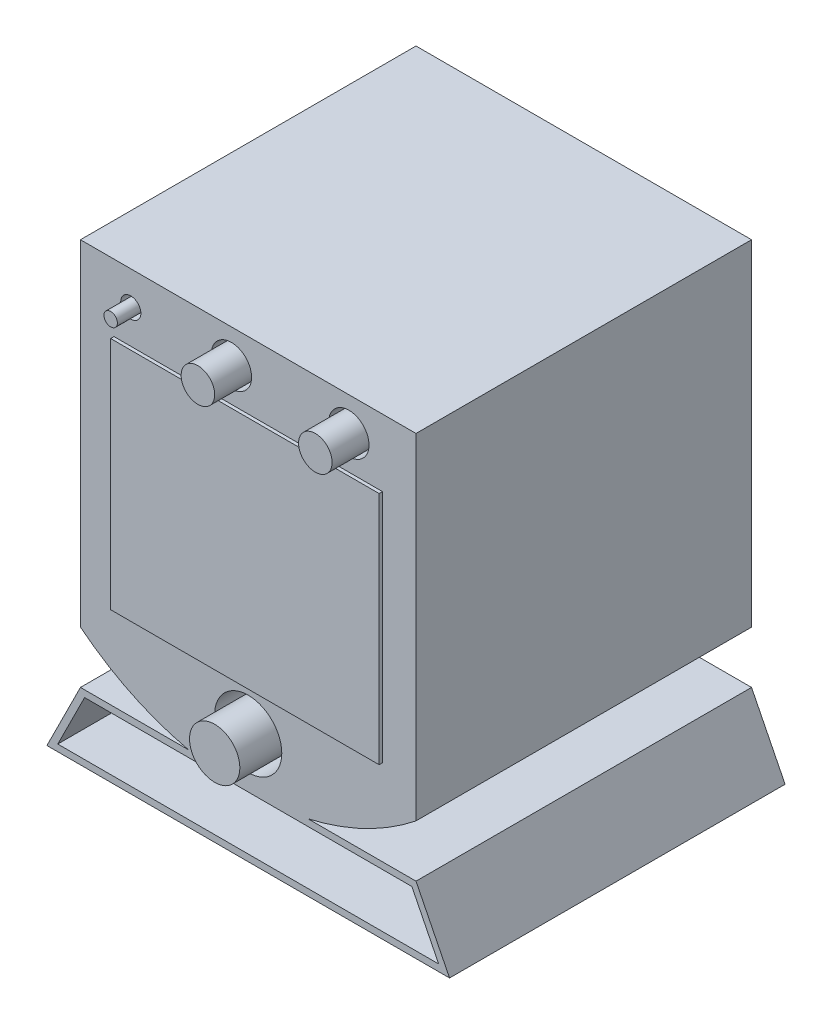
ISO-10303-21;
HEADER;
FILE_DESCRIPTION(('STEP AP214'),'2;1');
FILE_NAME('part.step','',(''),(''),'','','');
FILE_SCHEMA(('AUTOMOTIVE_DESIGN { 1 0 10303 214 1 1 1 1 }'));
ENDSEC;
DATA;
#1=APPLICATION_CONTEXT('core data for automotive mechanical design processes');
#2=APPLICATION_PROTOCOL_DEFINITION('international standard','automotive_design',2000,#1);
#3=PRODUCT_CONTEXT('',#1,'mechanical');
#4=PRODUCT('Part','Part','',(#3));
#5=PRODUCT_RELATED_PRODUCT_CATEGORY('part','',(#4));
#6=PRODUCT_DEFINITION_FORMATION('','',#4);
#7=PRODUCT_DEFINITION_CONTEXT('part definition',#1,'design');
#8=PRODUCT_DEFINITION('design','',#6,#7);
#9=PRODUCT_DEFINITION_SHAPE('','',#8);
#10=(LENGTH_UNIT() NAMED_UNIT(*) SI_UNIT(.MILLI.,.METRE.));
#11=(NAMED_UNIT(*) PLANE_ANGLE_UNIT() SI_UNIT($,.RADIAN.));
#12=(NAMED_UNIT(*) SI_UNIT($,.STERADIAN.) SOLID_ANGLE_UNIT());
#13=UNCERTAINTY_MEASURE_WITH_UNIT(LENGTH_MEASURE(1.E-05),#10,'distance_accuracy_value','');
#14=(GEOMETRIC_REPRESENTATION_CONTEXT(3) GLOBAL_UNCERTAINTY_ASSIGNED_CONTEXT((#13)) GLOBAL_UNIT_ASSIGNED_CONTEXT((#10,
#11,#12)) REPRESENTATION_CONTEXT('',''));
#15=CARTESIAN_POINT('',(0.,0.,0.));
#16=DIRECTION('',(0.,0.,1.));
#17=DIRECTION('',(1.,0.,0.));
#18=AXIS2_PLACEMENT_3D('',#15,#16,#17);
#19=CARTESIAN_POINT('',(0.,0.,50.));
#20=DIRECTION('',(0.,0.,1.));
#21=DIRECTION('',(1.,0.,0.));
#22=AXIS2_PLACEMENT_3D('',#19,#20,#21);
#23=PLANE('',#22);
#24=CARTESIAN_POINT('',(0.,23.7965051793557,50.));
#25=DIRECTION('',(0.,0.,1.));
#26=DIRECTION('',(1.,0.,0.));
#27=AXIS2_PLACEMENT_3D('',#24,#25,#26);
#28=CIRCLE('',#27,10.);
#29=CARTESIAN_POINT('',(10.,23.7965051793557,50.));
#30=VERTEX_POINT('',#29);
#31=EDGE_CURVE('E487',#30,#30,#28,.T.);
#32=ORIENTED_EDGE('',*,*,#31,.F.);
#33=EDGE_LOOP('',(#32));
#34=FACE_BOUND('',#33,.T.);
#35=CARTESIAN_POINT('',(30.,116.346525195372,50.));
#36=DIRECTION('',(0.,0.,1.));
#37=DIRECTION('',(1.,0.,0.));
#38=AXIS2_PLACEMENT_3D('',#35,#36,#37);
#39=CIRCLE('',#38,6.00000000000001);
#40=CARTESIAN_POINT('',(36.,116.346525195372,50.));
#41=VERTEX_POINT('',#40);
#42=EDGE_CURVE('E494',#41,#41,#39,.T.);
#43=ORIENTED_EDGE('',*,*,#42,.F.);
#44=EDGE_LOOP('',(#43));
#45=FACE_BOUND('',#44,.T.);
#46=CARTESIAN_POINT('',(-5.,116.346525195372,50.));
#47=DIRECTION('',(0.,0.,1.));
#48=DIRECTION('',(1.,0.,0.));
#49=AXIS2_PLACEMENT_3D('',#46,#47,#48);
#50=CIRCLE('',#49,6.00000000000001);
#51=CARTESIAN_POINT('',(1.00000000000001,116.346525195372,50.));
#52=VERTEX_POINT('',#51);
#53=EDGE_CURVE('E493',#52,#52,#50,.T.);
#54=ORIENTED_EDGE('',*,*,#53,.F.);
#55=EDGE_LOOP('',(#54));
#56=FACE_BOUND('',#55,.T.);
#57=CARTESIAN_POINT('',(-35.,116.346525195372,50.));
#58=DIRECTION('',(0.,0.,1.));
#59=DIRECTION('',(1.,0.,0.));
#60=AXIS2_PLACEMENT_3D('',#57,#58,#59);
#61=CIRCLE('',#60,3.);
#62=CARTESIAN_POINT('',(-32.,116.346525195372,50.));
#63=VERTEX_POINT('',#62);
#64=EDGE_CURVE('E505',#63,#63,#61,.T.);
#65=ORIENTED_EDGE('',*,*,#64,.F.);
#66=EDGE_LOOP('',(#65));
#67=FACE_BOUND('',#66,.T.);
#68=DIRECTION('',(-0.447213595499958,-0.894427190999916,0.));
#69=VECTOR('',#68,1.);
#70=CARTESIAN_POINT('',(-42.5297476897425,21.2648738448713,50.));
#71=LINE('',#70,#69);
#72=CARTESIAN_POINT('',(-48.7639320225002,8.79650517935577,50.));
#73=VERTEX_POINT('',#72);
#74=CARTESIAN_POINT('',(-56.7639320225002,-7.20349482064419,50.));
#75=VERTEX_POINT('',#74);
#76=EDGE_CURVE('E259',#73,#75,#71,.T.);
#77=ORIENTED_EDGE('',*,*,#76,.F.);
#78=DIRECTION('',(-1.,0.,0.));
#79=VECTOR('',#78,1.);
#80=CARTESIAN_POINT('',(0.,8.79650517935576,50.));
#81=LINE('',#80,#79);
#82=CARTESIAN_POINT('',(48.7639320225002,8.79650517935575,50.));
#83=VERTEX_POINT('',#82);
#84=EDGE_CURVE('E256',#83,#73,#81,.T.);
#85=ORIENTED_EDGE('',*,*,#84,.F.);
#86=DIRECTION('',(-0.447213595499958,0.894427190999916,0.));
#87=VECTOR('',#86,1.);
#88=CARTESIAN_POINT('',(42.5297476897425,21.2648738448712,50.));
#89=LINE('',#88,#87);
#90=CARTESIAN_POINT('',(56.7639320225002,-7.20349482064424,50.));
#91=VERTEX_POINT('',#90);
#92=EDGE_CURVE('E254',#91,#83,#89,.T.);
#93=ORIENTED_EDGE('',*,*,#92,.F.);
#94=DIRECTION('',(1.,0.,0.));
#95=VECTOR('',#94,1.);
#96=CARTESIAN_POINT('',(0.,-7.20349482064421,50.));
#97=LINE('',#96,#95);
#98=EDGE_CURVE('E262',#75,#91,#97,.T.);
#99=ORIENTED_EDGE('',*,*,#98,.F.);
#100=EDGE_LOOP('',(#77,#85,#93,#99));
#101=FACE_BOUND('',#100,.T.);
#102=DIRECTION('',(-1.,0.,0.));
#103=VECTOR('',#102,1.);
#104=CARTESIAN_POINT('',(-50.,10.7965051793558,50.));
#105=LINE('',#104,#103);
#106=CARTESIAN_POINT('',(50.,10.7965051793557,50.));
#107=VERTEX_POINT('',#106);
#108=CARTESIAN_POINT('',(17.776388834631,10.7965051793558,50.));
#109=VERTEX_POINT('',#108);
#110=EDGE_CURVE('E289',#107,#109,#105,.T.);
#111=ORIENTED_EDGE('',*,*,#110,.T.);
#112=CARTESIAN_POINT('',(0.,88.7965051793558,50.));
#113=DIRECTION('',(0.,0.,1.));
#114=DIRECTION('',(1.,0.,0.));
#115=AXIS2_PLACEMENT_3D('',#112,#113,#114);
#116=CIRCLE('',#115,80.);
#117=CARTESIAN_POINT('',(50.,26.3465251953718,50.));
#118=VERTEX_POINT('',#117);
#119=EDGE_CURVE('E223',#109,#118,#116,.T.);
#120=ORIENTED_EDGE('',*,*,#119,.T.);
#121=DIRECTION('',(0.,1.,0.));
#122=VECTOR('',#121,1.);
#123=CARTESIAN_POINT('',(50.,26.3465251953718,50.));
#124=LINE('',#123,#122);
#125=CARTESIAN_POINT('',(50.,126.346525195372,50.));
#126=VERTEX_POINT('',#125);
#127=EDGE_CURVE('E222',#118,#126,#124,.T.);
#128=ORIENTED_EDGE('',*,*,#127,.T.);
#129=DIRECTION('',(-1.,0.,0.));
#130=VECTOR('',#129,1.);
#131=CARTESIAN_POINT('',(-50.,126.346525195372,50.));
#132=LINE('',#131,#130);
#133=CARTESIAN_POINT('',(-50.,126.346525195372,50.));
#134=VERTEX_POINT('',#133);
#135=EDGE_CURVE('E225',#126,#134,#132,.T.);
#136=ORIENTED_EDGE('',*,*,#135,.T.);
#137=DIRECTION('',(0.,-1.,0.));
#138=VECTOR('',#137,1.);
#139=CARTESIAN_POINT('',(-50.,26.3465251953718,50.));
#140=LINE('',#139,#138);
#141=CARTESIAN_POINT('',(-50.,26.3465251953718,50.));
#142=VERTEX_POINT('',#141);
#143=EDGE_CURVE('E227',#134,#142,#140,.T.);
#144=ORIENTED_EDGE('',*,*,#143,.T.);
#145=CARTESIAN_POINT('',(-17.7763888346311,10.7965051793558,50.));
#146=VERTEX_POINT('',#145);
#147=EDGE_CURVE('E219',#142,#146,#116,.T.);
#148=ORIENTED_EDGE('',*,*,#147,.T.);
#149=CARTESIAN_POINT('',(-50.,10.7965051793558,50.));
#150=VERTEX_POINT('',#149);
#151=EDGE_CURVE('E84',#146,#150,#105,.T.);
#152=ORIENTED_EDGE('',*,*,#151,.T.);
#153=DIRECTION('',(-0.447213595499958,-0.894427190999916,0.));
#154=VECTOR('',#153,1.);
#155=CARTESIAN_POINT('',(-50.,10.7965051793558,50.));
#156=LINE('',#155,#154);
#157=CARTESIAN_POINT('',(-60.,-9.20349482064418,50.));
#158=VERTEX_POINT('',#157);
#159=EDGE_CURVE('E292',#150,#158,#156,.T.);
#160=ORIENTED_EDGE('',*,*,#159,.T.);
#161=DIRECTION('',(1.,0.,0.));
#162=VECTOR('',#161,1.);
#163=CARTESIAN_POINT('',(60.,-9.20349482064424,50.));
#164=LINE('',#163,#162);
#165=CARTESIAN_POINT('',(60.,-9.20349482064424,50.));
#166=VERTEX_POINT('',#165);
#167=EDGE_CURVE('E294',#158,#166,#164,.T.);
#168=ORIENTED_EDGE('',*,*,#167,.T.);
#169=DIRECTION('',(-0.447213595499958,0.894427190999916,0.));
#170=VECTOR('',#169,1.);
#171=CARTESIAN_POINT('',(50.,10.7965051793557,50.));
#172=LINE('',#171,#170);
#173=EDGE_CURVE('E285',#166,#107,#172,.T.);
#174=ORIENTED_EDGE('',*,*,#173,.T.);
#175=EDGE_LOOP('',(#111,#120,#128,#136,#144,#148,#152,#160,#168,#174));
#176=FACE_BOUND('',#175,.T.);
#177=DIRECTION('',(1.,0.,0.));
#178=VECTOR('',#177,1.);
#179=CARTESIAN_POINT('',(-40.,36.3465251953718,50.));
#180=LINE('',#179,#178);
#181=CARTESIAN_POINT('',(-40.,36.3465251953718,50.));
#182=VERTEX_POINT('',#181);
#183=CARTESIAN_POINT('',(40.,36.3465251953718,50.));
#184=VERTEX_POINT('',#183);
#185=EDGE_CURVE('E517',#182,#184,#180,.T.);
#186=ORIENTED_EDGE('',*,*,#185,.F.);
#187=DIRECTION('',(0.,-1.,0.));
#188=VECTOR('',#187,1.);
#189=CARTESIAN_POINT('',(-40.,106.346525195372,50.));
#190=LINE('',#189,#188);
#191=CARTESIAN_POINT('',(-40.,106.346525195372,50.));
#192=VERTEX_POINT('',#191);
#193=EDGE_CURVE('E210',#192,#182,#190,.T.);
#194=ORIENTED_EDGE('',*,*,#193,.F.);
#195=DIRECTION('',(-1.,0.,0.));
#196=VECTOR('',#195,1.);
#197=CARTESIAN_POINT('',(-40.,106.346525195372,50.));
#198=LINE('',#197,#196);
#199=CARTESIAN_POINT('',(40.,106.346525195372,50.));
#200=VERTEX_POINT('',#199);
#201=EDGE_CURVE('E206',#200,#192,#198,.T.);
#202=ORIENTED_EDGE('',*,*,#201,.F.);
#203=DIRECTION('',(0.,1.,0.));
#204=VECTOR('',#203,1.);
#205=CARTESIAN_POINT('',(40.,106.346525195372,50.));
#206=LINE('',#205,#204);
#207=EDGE_CURVE('E519',#184,#200,#206,.T.);
#208=ORIENTED_EDGE('',*,*,#207,.F.);
#209=EDGE_LOOP('',(#186,#194,#202,#208));
#210=FACE_BOUND('',#209,.T.);
#211=ADVANCED_FACE('F61',(#34,#45,#56,#67,#101,#176,#210),#23,.T.);
#212=CARTESIAN_POINT('',(-50.,10.7965051793558,50.));
#213=DIRECTION('',(0.,-1.,0.));
#214=DIRECTION('',(1.,0.,0.));
#215=AXIS2_PLACEMENT_3D('',#212,#213,#214);
#216=PLANE('',#215);
#217=DIRECTION('',(0.,0.,-1.));
#218=VECTOR('',#217,1.);
#219=CARTESIAN_POINT('',(-17.7763888346311,10.7965051793558,50.));
#220=LINE('',#219,#218);
#221=CARTESIAN_POINT('',(-17.7763888346311,10.7965051793558,-50.));
#222=VERTEX_POINT('',#221);
#223=EDGE_CURVE('E251',#222,#146,#220,.F.);
#224=ORIENTED_EDGE('',*,*,#223,.F.);
#225=DIRECTION('',(-1.,0.,0.));
#226=VECTOR('',#225,1.);
#227=CARTESIAN_POINT('',(-50.,10.7965051793558,-50.));
#228=LINE('',#227,#226);
#229=CARTESIAN_POINT('',(-50.,10.7965051793558,-50.));
#230=VERTEX_POINT('',#229);
#231=EDGE_CURVE('E299',#222,#230,#228,.T.);
#232=ORIENTED_EDGE('',*,*,#231,.T.);
#233=DIRECTION('',(0.,0.,-1.));
#234=VECTOR('',#233,1.);
#235=CARTESIAN_POINT('',(-50.,10.7965051793558,50.));
#236=LINE('',#235,#234);
#237=EDGE_CURVE('E69',#150,#230,#236,.T.);
#238=ORIENTED_EDGE('',*,*,#237,.F.);
#239=ORIENTED_EDGE('',*,*,#151,.F.);
#240=EDGE_LOOP('',(#224,#232,#238,#239));
#241=FACE_BOUND('',#240,.T.);
#242=ADVANCED_FACE('F336',(#241),#216,.F.);
#243=DIRECTION('',(0.,0.,-1.));
#244=VECTOR('',#243,1.);
#245=CARTESIAN_POINT('',(17.776388834631,10.7965051793558,50.));
#246=LINE('',#245,#244);
#247=CARTESIAN_POINT('',(17.776388834631,10.7965051793558,-50.));
#248=VERTEX_POINT('',#247);
#249=EDGE_CURVE('E248',#109,#248,#246,.T.);
#250=ORIENTED_EDGE('',*,*,#249,.F.);
#251=ORIENTED_EDGE('',*,*,#110,.F.);
#252=DIRECTION('',(0.,0.,-1.));
#253=VECTOR('',#252,1.);
#254=CARTESIAN_POINT('',(50.,10.7965051793557,50.));
#255=LINE('',#254,#253);
#256=CARTESIAN_POINT('',(50.,10.7965051793557,-50.));
#257=VERTEX_POINT('',#256);
#258=EDGE_CURVE('E12',#107,#257,#255,.T.);
#259=ORIENTED_EDGE('',*,*,#258,.T.);
#260=EDGE_CURVE('E300',#257,#248,#228,.T.);
#261=ORIENTED_EDGE('',*,*,#260,.T.);
#262=EDGE_LOOP('',(#250,#251,#259,#261));
#263=FACE_BOUND('',#262,.T.);
#264=ADVANCED_FACE('F338',(#263),#216,.F.);
#265=CARTESIAN_POINT('',(0.,0.,-50.));
#266=DIRECTION('',(0.,0.,1.));
#267=DIRECTION('',(1.,0.,0.));
#268=AXIS2_PLACEMENT_3D('',#265,#266,#267);
#269=PLANE('',#268);
#270=DIRECTION('',(-1.,0.,0.));
#271=VECTOR('',#270,1.);
#272=CARTESIAN_POINT('',(0.,8.79650517935576,-50.));
#273=LINE('',#272,#271);
#274=CARTESIAN_POINT('',(48.7639320225002,8.79650517935575,-50.));
#275=VERTEX_POINT('',#274);
#276=CARTESIAN_POINT('',(-48.7639320225002,8.79650517935577,-50.));
#277=VERTEX_POINT('',#276);
#278=EDGE_CURVE('E267',#275,#277,#273,.T.);
#279=ORIENTED_EDGE('',*,*,#278,.T.);
#280=DIRECTION('',(-0.447213595499958,-0.894427190999916,0.));
#281=VECTOR('',#280,1.);
#282=CARTESIAN_POINT('',(-42.5297476897425,21.2648738448713,-50.));
#283=LINE('',#282,#281);
#284=CARTESIAN_POINT('',(-56.7639320225002,-7.20349482064419,-50.));
#285=VERTEX_POINT('',#284);
#286=EDGE_CURVE('E269',#277,#285,#283,.T.);
#287=ORIENTED_EDGE('',*,*,#286,.T.);
#288=DIRECTION('',(1.,0.,0.));
#289=VECTOR('',#288,1.);
#290=CARTESIAN_POINT('',(0.,-7.20349482064421,-50.));
#291=LINE('',#290,#289);
#292=CARTESIAN_POINT('',(56.7639320225002,-7.20349482064424,-50.));
#293=VERTEX_POINT('',#292);
#294=EDGE_CURVE('E257',#285,#293,#291,.T.);
#295=ORIENTED_EDGE('',*,*,#294,.T.);
#296=DIRECTION('',(-0.447213595499958,0.894427190999916,0.));
#297=VECTOR('',#296,1.);
#298=CARTESIAN_POINT('',(42.5297476897425,21.2648738448712,-50.));
#299=LINE('',#298,#297);
#300=EDGE_CURVE('E253',#293,#275,#299,.T.);
#301=ORIENTED_EDGE('',*,*,#300,.T.);
#302=EDGE_LOOP('',(#279,#287,#295,#301));
#303=FACE_BOUND('',#302,.T.);
#304=CARTESIAN_POINT('',(0.,88.7965051793558,-50.));
#305=DIRECTION('',(0.,0.,1.));
#306=DIRECTION('',(1.,0.,0.));
#307=AXIS2_PLACEMENT_3D('',#304,#305,#306);
#308=CIRCLE('',#307,80.);
#309=CARTESIAN_POINT('',(50.,26.3465251953718,-50.));
#310=VERTEX_POINT('',#309);
#311=EDGE_CURVE('E212',#248,#310,#308,.T.);
#312=ORIENTED_EDGE('',*,*,#311,.F.);
#313=ORIENTED_EDGE('',*,*,#260,.F.);
#314=DIRECTION('',(-0.447213595499958,0.894427190999916,0.));
#315=VECTOR('',#314,1.);
#316=CARTESIAN_POINT('',(50.,10.7965051793557,-50.));
#317=LINE('',#316,#315);
#318=CARTESIAN_POINT('',(60.,-9.20349482064424,-50.));
#319=VERTEX_POINT('',#318);
#320=EDGE_CURVE('E284',#319,#257,#317,.T.);
#321=ORIENTED_EDGE('',*,*,#320,.F.);
#322=DIRECTION('',(1.,0.,0.));
#323=VECTOR('',#322,1.);
#324=CARTESIAN_POINT('',(60.,-9.20349482064424,-50.));
#325=LINE('',#324,#323);
#326=CARTESIAN_POINT('',(-60.,-9.20349482064418,-50.));
#327=VERTEX_POINT('',#326);
#328=EDGE_CURVE('E288',#327,#319,#325,.T.);
#329=ORIENTED_EDGE('',*,*,#328,.F.);
#330=DIRECTION('',(-0.447213595499958,-0.894427190999916,0.));
#331=VECTOR('',#330,1.);
#332=CARTESIAN_POINT('',(-50.,10.7965051793558,-50.));
#333=LINE('',#332,#331);
#334=EDGE_CURVE('E302',#230,#327,#333,.T.);
#335=ORIENTED_EDGE('',*,*,#334,.F.);
#336=ORIENTED_EDGE('',*,*,#231,.F.);
#337=CARTESIAN_POINT('',(-50.,26.3465251953718,-50.));
#338=VERTEX_POINT('',#337);
#339=EDGE_CURVE('E214',#338,#222,#308,.T.);
#340=ORIENTED_EDGE('',*,*,#339,.F.);
#341=DIRECTION('',(0.,-1.,0.));
#342=VECTOR('',#341,1.);
#343=CARTESIAN_POINT('',(-50.,26.3465251953718,-50.));
#344=LINE('',#343,#342);
#345=CARTESIAN_POINT('',(-50.,126.346525195372,-50.));
#346=VERTEX_POINT('',#345);
#347=EDGE_CURVE('E235',#346,#338,#344,.T.);
#348=ORIENTED_EDGE('',*,*,#347,.F.);
#349=DIRECTION('',(-1.,0.,0.));
#350=VECTOR('',#349,1.);
#351=CARTESIAN_POINT('',(-50.,126.346525195372,-50.));
#352=LINE('',#351,#350);
#353=CARTESIAN_POINT('',(50.,126.346525195372,-50.));
#354=VERTEX_POINT('',#353);
#355=EDGE_CURVE('E233',#354,#346,#352,.T.);
#356=ORIENTED_EDGE('',*,*,#355,.F.);
#357=DIRECTION('',(0.,1.,0.));
#358=VECTOR('',#357,1.);
#359=CARTESIAN_POINT('',(50.,26.3465251953718,-50.));
#360=LINE('',#359,#358);
#361=EDGE_CURVE('E231',#310,#354,#360,.T.);
#362=ORIENTED_EDGE('',*,*,#361,.F.);
#363=EDGE_LOOP('',(#312,#313,#321,#329,#335,#336,#340,#348,#356,#362));
#364=FACE_BOUND('',#363,.T.);
#365=ADVANCED_FACE('F318',(#303,#364),#269,.F.);
#366=CARTESIAN_POINT('',(50.,10.7965051793557,50.));
#367=DIRECTION('',(-0.894427190999916,-0.447213595499958,0.));
#368=DIRECTION('',(0.447213595499958,-0.894427190999916,0.));
#369=AXIS2_PLACEMENT_3D('',#366,#367,#368);
#370=PLANE('',#369);
#371=ORIENTED_EDGE('',*,*,#320,.T.);
#372=ORIENTED_EDGE('',*,*,#258,.F.);
#373=ORIENTED_EDGE('',*,*,#173,.F.);
#374=DIRECTION('',(0.,0.,-1.));
#375=VECTOR('',#374,1.);
#376=CARTESIAN_POINT('',(60.,-9.20349482064424,50.));
#377=LINE('',#376,#375);
#378=EDGE_CURVE('E296',#166,#319,#377,.T.);
#379=ORIENTED_EDGE('',*,*,#378,.T.);
#380=EDGE_LOOP('',(#371,#372,#373,#379));
#381=FACE_BOUND('',#380,.T.);
#382=ADVANCED_FACE('F63',(#381),#370,.F.);
#383=CARTESIAN_POINT('',(-50.,10.7965051793558,50.));
#384=DIRECTION('',(0.894427190999916,-0.447213595499958,0.));
#385=DIRECTION('',(0.447213595499958,0.894427190999916,0.));
#386=AXIS2_PLACEMENT_3D('',#383,#384,#385);
#387=PLANE('',#386);
#388=ORIENTED_EDGE('',*,*,#334,.T.);
#389=DIRECTION('',(0.,0.,-1.));
#390=VECTOR('',#389,1.);
#391=CARTESIAN_POINT('',(-60.,-9.20349482064418,50.));
#392=LINE('',#391,#390);
#393=EDGE_CURVE('E307',#158,#327,#392,.T.);
#394=ORIENTED_EDGE('',*,*,#393,.F.);
#395=ORIENTED_EDGE('',*,*,#159,.F.);
#396=ORIENTED_EDGE('',*,*,#237,.T.);
#397=EDGE_LOOP('',(#388,#394,#395,#396));
#398=FACE_BOUND('',#397,.T.);
#399=ADVANCED_FACE('F313',(#398),#387,.F.);
#400=CARTESIAN_POINT('',(60.,-9.20349482064424,50.));
#401=DIRECTION('',(0.,1.,0.));
#402=DIRECTION('',(-1.,0.,0.));
#403=AXIS2_PLACEMENT_3D('',#400,#401,#402);
#404=PLANE('',#403);
#405=ORIENTED_EDGE('',*,*,#328,.T.);
#406=ORIENTED_EDGE('',*,*,#378,.F.);
#407=ORIENTED_EDGE('',*,*,#167,.F.);
#408=ORIENTED_EDGE('',*,*,#393,.T.);
#409=EDGE_LOOP('',(#405,#406,#407,#408));
#410=FACE_BOUND('',#409,.T.);
#411=ADVANCED_FACE('F323',(#410),#404,.F.);
#412=CARTESIAN_POINT('',(42.5297476897425,21.2648738448712,50.));
#413=DIRECTION('',(-0.894427190999916,-0.447213595499958,0.));
#414=DIRECTION('',(0.447213595499958,-0.894427190999916,0.));
#415=AXIS2_PLACEMENT_3D('',#412,#413,#414);
#416=PLANE('',#415);
#417=ORIENTED_EDGE('',*,*,#300,.F.);
#418=DIRECTION('',(0.,0.,-1.));
#419=VECTOR('',#418,1.);
#420=CARTESIAN_POINT('',(56.7639320225002,-7.20349482064424,50.));
#421=LINE('',#420,#419);
#422=EDGE_CURVE('E264',#91,#293,#421,.T.);
#423=ORIENTED_EDGE('',*,*,#422,.F.);
#424=ORIENTED_EDGE('',*,*,#92,.T.);
#425=DIRECTION('',(0.,0.,-1.));
#426=VECTOR('',#425,1.);
#427=CARTESIAN_POINT('',(48.7639320225002,8.79650517935575,50.));
#428=LINE('',#427,#426);
#429=EDGE_CURVE('E281',#83,#275,#428,.T.);
#430=ORIENTED_EDGE('',*,*,#429,.T.);
#431=EDGE_LOOP('',(#417,#423,#424,#430));
#432=FACE_BOUND('',#431,.T.);
#433=ADVANCED_FACE('F351',(#432),#416,.T.);
#434=CARTESIAN_POINT('',(0.,8.79650517935576,50.));
#435=DIRECTION('',(0.,-1.,0.));
#436=DIRECTION('',(1.,0.,0.));
#437=AXIS2_PLACEMENT_3D('',#434,#435,#436);
#438=PLANE('',#437);
#439=ORIENTED_EDGE('',*,*,#84,.T.);
#440=DIRECTION('',(0.,0.,-1.));
#441=VECTOR('',#440,1.);
#442=CARTESIAN_POINT('',(-48.7639320225002,8.79650517935577,50.));
#443=LINE('',#442,#441);
#444=EDGE_CURVE('E278',#73,#277,#443,.T.);
#445=ORIENTED_EDGE('',*,*,#444,.T.);
#446=ORIENTED_EDGE('',*,*,#278,.F.);
#447=ORIENTED_EDGE('',*,*,#429,.F.);
#448=EDGE_LOOP('',(#439,#445,#446,#447));
#449=FACE_BOUND('',#448,.T.);
#450=ADVANCED_FACE('F357',(#449),#438,.T.);
#451=CARTESIAN_POINT('',(-42.5297476897425,21.2648738448713,50.));
#452=DIRECTION('',(0.894427190999916,-0.447213595499958,0.));
#453=DIRECTION('',(0.447213595499958,0.894427190999916,0.));
#454=AXIS2_PLACEMENT_3D('',#451,#452,#453);
#455=PLANE('',#454);
#456=ORIENTED_EDGE('',*,*,#286,.F.);
#457=ORIENTED_EDGE('',*,*,#444,.F.);
#458=ORIENTED_EDGE('',*,*,#76,.T.);
#459=DIRECTION('',(0.,0.,-1.));
#460=VECTOR('',#459,1.);
#461=CARTESIAN_POINT('',(-56.7639320225002,-7.20349482064419,50.));
#462=LINE('',#461,#460);
#463=EDGE_CURVE('E276',#75,#285,#462,.T.);
#464=ORIENTED_EDGE('',*,*,#463,.T.);
#465=EDGE_LOOP('',(#456,#457,#458,#464));
#466=FACE_BOUND('',#465,.T.);
#467=ADVANCED_FACE('F361',(#466),#455,.T.);
#468=CARTESIAN_POINT('',(0.,-7.20349482064421,50.));
#469=DIRECTION('',(0.,1.,0.));
#470=DIRECTION('',(-1.,0.,0.));
#471=AXIS2_PLACEMENT_3D('',#468,#469,#470);
#472=PLANE('',#471);
#473=ORIENTED_EDGE('',*,*,#294,.F.);
#474=ORIENTED_EDGE('',*,*,#463,.F.);
#475=ORIENTED_EDGE('',*,*,#98,.T.);
#476=ORIENTED_EDGE('',*,*,#422,.T.);
#477=EDGE_LOOP('',(#473,#474,#475,#476));
#478=FACE_BOUND('',#477,.T.);
#479=ADVANCED_FACE('F365',(#478),#472,.T.);
#480=CARTESIAN_POINT('',(0.,88.7965051793558,50.));
#481=DIRECTION('',(0.,0.,-1.));
#482=DIRECTION('',(-1.,0.,0.));
#483=AXIS2_PLACEMENT_3D('',#480,#481,#482);
#484=CYLINDRICAL_SURFACE('',#483,80.);
#485=ORIENTED_EDGE('',*,*,#339,.T.);
#486=ORIENTED_EDGE('',*,*,#223,.T.);
#487=ORIENTED_EDGE('',*,*,#147,.F.);
#488=DIRECTION('',(0.,0.,-1.));
#489=VECTOR('',#488,1.);
#490=CARTESIAN_POINT('',(-50.,26.3465251953718,50.));
#491=LINE('',#490,#489);
#492=EDGE_CURVE('E228',#142,#338,#491,.T.);
#493=ORIENTED_EDGE('',*,*,#492,.T.);
#494=EDGE_LOOP('',(#485,#486,#487,#493));
#495=FACE_BOUND('',#494,.T.);
#496=ADVANCED_FACE('F335',(#495),#484,.T.);
#497=ORIENTED_EDGE('',*,*,#119,.F.);
#498=ORIENTED_EDGE('',*,*,#249,.T.);
#499=ORIENTED_EDGE('',*,*,#311,.T.);
#500=DIRECTION('',(0.,0.,-1.));
#501=VECTOR('',#500,1.);
#502=CARTESIAN_POINT('',(50.,26.3465251953718,50.));
#503=LINE('',#502,#501);
#504=EDGE_CURVE('E245',#118,#310,#503,.T.);
#505=ORIENTED_EDGE('',*,*,#504,.F.);
#506=EDGE_LOOP('',(#497,#498,#499,#505));
#507=FACE_BOUND('',#506,.T.);
#508=ADVANCED_FACE('F372',(#507),#484,.T.);
#509=CARTESIAN_POINT('',(50.,26.3465251953718,50.));
#510=DIRECTION('',(-1.,0.,0.));
#511=DIRECTION('',(0.,0.,1.));
#512=AXIS2_PLACEMENT_3D('',#509,#510,#511);
#513=PLANE('',#512);
#514=ORIENTED_EDGE('',*,*,#361,.T.);
#515=DIRECTION('',(0.,0.,-1.));
#516=VECTOR('',#515,1.);
#517=CARTESIAN_POINT('',(50.,126.346525195372,50.));
#518=LINE('',#517,#516);
#519=EDGE_CURVE('E242',#126,#354,#518,.T.);
#520=ORIENTED_EDGE('',*,*,#519,.F.);
#521=ORIENTED_EDGE('',*,*,#127,.F.);
#522=ORIENTED_EDGE('',*,*,#504,.T.);
#523=EDGE_LOOP('',(#514,#520,#521,#522));
#524=FACE_BOUND('',#523,.T.);
#525=ADVANCED_FACE('F373',(#524),#513,.F.);
#526=CARTESIAN_POINT('',(-50.,126.346525195372,50.));
#527=DIRECTION('',(0.,-1.,0.));
#528=DIRECTION('',(0.,0.,-1.));
#529=AXIS2_PLACEMENT_3D('',#526,#527,#528);
#530=PLANE('',#529);
#531=ORIENTED_EDGE('',*,*,#355,.T.);
#532=DIRECTION('',(0.,0.,-1.));
#533=VECTOR('',#532,1.);
#534=CARTESIAN_POINT('',(-50.,126.346525195372,50.));
#535=LINE('',#534,#533);
#536=EDGE_CURVE('E239',#134,#346,#535,.T.);
#537=ORIENTED_EDGE('',*,*,#536,.F.);
#538=ORIENTED_EDGE('',*,*,#135,.F.);
#539=ORIENTED_EDGE('',*,*,#519,.T.);
#540=EDGE_LOOP('',(#531,#537,#538,#539));
#541=FACE_BOUND('',#540,.T.);
#542=ADVANCED_FACE('F376',(#541),#530,.F.);
#543=CARTESIAN_POINT('',(-50.,26.3465251953718,50.));
#544=DIRECTION('',(1.,0.,0.));
#545=DIRECTION('',(0.,0.,-1.));
#546=AXIS2_PLACEMENT_3D('',#543,#544,#545);
#547=PLANE('',#546);
#548=ORIENTED_EDGE('',*,*,#347,.T.);
#549=ORIENTED_EDGE('',*,*,#492,.F.);
#550=ORIENTED_EDGE('',*,*,#143,.F.);
#551=ORIENTED_EDGE('',*,*,#536,.T.);
#552=EDGE_LOOP('',(#548,#549,#550,#551));
#553=FACE_BOUND('',#552,.T.);
#554=ADVANCED_FACE('F380',(#553),#547,.F.);
#555=CARTESIAN_POINT('',(-40.,106.346525195372,51.));
#556=DIRECTION('',(1.,0.,0.));
#557=DIRECTION('',(0.,1.,0.));
#558=AXIS2_PLACEMENT_3D('',#555,#556,#557);
#559=PLANE('',#558);
#560=ORIENTED_EDGE('',*,*,#193,.T.);
#561=DIRECTION('',(0.,0.,-1.));
#562=VECTOR('',#561,1.);
#563=CARTESIAN_POINT('',(-40.,36.3465251953718,51.));
#564=LINE('',#563,#562);
#565=CARTESIAN_POINT('',(-40.,36.3465251953718,51.));
#566=VERTEX_POINT('',#565);
#567=EDGE_CURVE('E191',#566,#182,#564,.T.);
#568=ORIENTED_EDGE('',*,*,#567,.F.);
#569=DIRECTION('',(0.,-1.,0.));
#570=VECTOR('',#569,1.);
#571=CARTESIAN_POINT('',(-40.,106.346525195372,51.));
#572=LINE('',#571,#570);
#573=CARTESIAN_POINT('',(-40.,106.346525195372,51.));
#574=VERTEX_POINT('',#573);
#575=EDGE_CURVE('E198',#574,#566,#572,.T.);
#576=ORIENTED_EDGE('',*,*,#575,.F.);
#577=DIRECTION('',(0.,0.,-1.));
#578=VECTOR('',#577,1.);
#579=CARTESIAN_POINT('',(-40.,106.346525195372,51.));
#580=LINE('',#579,#578);
#581=EDGE_CURVE('E515',#574,#192,#580,.T.);
#582=ORIENTED_EDGE('',*,*,#581,.T.);
#583=EDGE_LOOP('',(#560,#568,#576,#582));
#584=FACE_BOUND('',#583,.T.);
#585=ADVANCED_FACE('F208',(#584),#559,.F.);
#586=CARTESIAN_POINT('',(-40.,36.3465251953718,51.));
#587=DIRECTION('',(0.,1.,0.));
#588=DIRECTION('',(0.,0.,1.));
#589=AXIS2_PLACEMENT_3D('',#586,#587,#588);
#590=PLANE('',#589);
#591=ORIENTED_EDGE('',*,*,#185,.T.);
#592=DIRECTION('',(0.,0.,-1.));
#593=VECTOR('',#592,1.);
#594=CARTESIAN_POINT('',(40.,36.3465251953718,51.));
#595=LINE('',#594,#593);
#596=CARTESIAN_POINT('',(40.,36.3465251953718,51.));
#597=VERTEX_POINT('',#596);
#598=EDGE_CURVE('E194',#597,#184,#595,.T.);
#599=ORIENTED_EDGE('',*,*,#598,.F.);
#600=DIRECTION('',(1.,0.,0.));
#601=VECTOR('',#600,1.);
#602=CARTESIAN_POINT('',(-40.,36.3465251953718,51.));
#603=LINE('',#602,#601);
#604=EDGE_CURVE('E187',#566,#597,#603,.T.);
#605=ORIENTED_EDGE('',*,*,#604,.F.);
#606=ORIENTED_EDGE('',*,*,#567,.T.);
#607=EDGE_LOOP('',(#591,#599,#605,#606));
#608=FACE_BOUND('',#607,.T.);
#609=ADVANCED_FACE('F189',(#608),#590,.F.);
#610=CARTESIAN_POINT('',(40.,106.346525195372,51.));
#611=DIRECTION('',(-1.,0.,0.));
#612=DIRECTION('',(0.,-1.,0.));
#613=AXIS2_PLACEMENT_3D('',#610,#611,#612);
#614=PLANE('',#613);
#615=ORIENTED_EDGE('',*,*,#207,.T.);
#616=DIRECTION('',(0.,0.,-1.));
#617=VECTOR('',#616,1.);
#618=CARTESIAN_POINT('',(40.,106.346525195372,51.));
#619=LINE('',#618,#617);
#620=CARTESIAN_POINT('',(40.,106.346525195372,51.));
#621=VERTEX_POINT('',#620);
#622=EDGE_CURVE('E76',#621,#200,#619,.T.);
#623=ORIENTED_EDGE('',*,*,#622,.F.);
#624=DIRECTION('',(0.,1.,0.));
#625=VECTOR('',#624,1.);
#626=CARTESIAN_POINT('',(40.,106.346525195372,51.));
#627=LINE('',#626,#625);
#628=EDGE_CURVE('E197',#597,#621,#627,.T.);
#629=ORIENTED_EDGE('',*,*,#628,.F.);
#630=ORIENTED_EDGE('',*,*,#598,.T.);
#631=EDGE_LOOP('',(#615,#623,#629,#630));
#632=FACE_BOUND('',#631,.T.);
#633=ADVANCED_FACE('F389',(#632),#614,.F.);
#634=CARTESIAN_POINT('',(-40.,106.346525195372,51.));
#635=DIRECTION('',(0.,-1.,0.));
#636=DIRECTION('',(0.,0.,-1.));
#637=AXIS2_PLACEMENT_3D('',#634,#635,#636);
#638=PLANE('',#637);
#639=ORIENTED_EDGE('',*,*,#201,.T.);
#640=ORIENTED_EDGE('',*,*,#581,.F.);
#641=DIRECTION('',(-1.,0.,0.));
#642=VECTOR('',#641,1.);
#643=CARTESIAN_POINT('',(-40.,106.346525195372,51.));
#644=LINE('',#643,#642);
#645=EDGE_CURVE('E202',#621,#574,#644,.T.);
#646=ORIENTED_EDGE('',*,*,#645,.F.);
#647=ORIENTED_EDGE('',*,*,#622,.T.);
#648=EDGE_LOOP('',(#639,#640,#646,#647));
#649=FACE_BOUND('',#648,.T.);
#650=ADVANCED_FACE('F392',(#649),#638,.F.);
#651=CARTESIAN_POINT('',(0.,0.,51.));
#652=DIRECTION('',(0.,0.,1.));
#653=DIRECTION('',(1.,0.,0.));
#654=AXIS2_PLACEMENT_3D('',#651,#652,#653);
#655=PLANE('',#654);
#656=ORIENTED_EDGE('',*,*,#575,.T.);
#657=ORIENTED_EDGE('',*,*,#604,.T.);
#658=ORIENTED_EDGE('',*,*,#628,.T.);
#659=ORIENTED_EDGE('',*,*,#645,.T.);
#660=EDGE_LOOP('',(#656,#657,#658,#659));
#661=FACE_BOUND('',#660,.T.);
#662=ADVANCED_FACE('F201',(#661),#655,.T.);
#663=CARTESIAN_POINT('',(-35.,116.346525195372,40.));
#664=DIRECTION('',(0.,0.,1.));
#665=DIRECTION('',(1.,0.,0.));
#666=AXIS2_PLACEMENT_3D('',#663,#664,#665);
#667=CYLINDRICAL_SURFACE('',#666,3.);
#668=CARTESIAN_POINT('',(-35.,116.346525195372,40.));
#669=DIRECTION('',(0.,0.,1.));
#670=DIRECTION('',(1.,0.,0.));
#671=AXIS2_PLACEMENT_3D('',#668,#669,#670);
#672=CIRCLE('',#671,3.);
#673=CARTESIAN_POINT('',(-32.,116.346525195372,40.));
#674=VERTEX_POINT('',#673);
#675=EDGE_CURVE('E508',#674,#674,#672,.T.);
#676=ORIENTED_EDGE('',*,*,#675,.F.);
#677=EDGE_LOOP('',(#676));
#678=FACE_BOUND('',#677,.T.);
#679=ORIENTED_EDGE('',*,*,#64,.T.);
#680=EDGE_LOOP('',(#679));
#681=FACE_BOUND('',#680,.T.);
#682=ADVANCED_FACE('F398',(#678,#681),#667,.F.);
#683=CARTESIAN_POINT('',(-35.,116.346525195372,40.));
#684=DIRECTION('',(0.,0.,1.));
#685=DIRECTION('',(1.,0.,0.));
#686=AXIS2_PLACEMENT_3D('',#683,#684,#685);
#687=PLANE('',#686);
#688=CARTESIAN_POINT('',(-35.,116.346525195372,40.));
#689=DIRECTION('',(0.,0.,1.));
#690=DIRECTION('',(1.,0.,0.));
#691=AXIS2_PLACEMENT_3D('',#688,#689,#690);
#692=CIRCLE('',#691,2.);
#693=CARTESIAN_POINT('',(-33.,116.346525195372,40.));
#694=VERTEX_POINT('',#693);
#695=EDGE_CURVE('E467',#694,#694,#692,.T.);
#696=ORIENTED_EDGE('',*,*,#695,.F.);
#697=EDGE_LOOP('',(#696));
#698=FACE_BOUND('',#697,.T.);
#699=ORIENTED_EDGE('',*,*,#675,.T.);
#700=EDGE_LOOP('',(#699));
#701=FACE_BOUND('',#700,.T.);
#702=ADVANCED_FACE('F401',(#698,#701),#687,.T.);
#703=CARTESIAN_POINT('',(-5.,116.346525195372,40.));
#704=DIRECTION('',(0.,0.,1.));
#705=DIRECTION('',(1.,0.,0.));
#706=AXIS2_PLACEMENT_3D('',#703,#704,#705);
#707=CYLINDRICAL_SURFACE('',#706,6.00000000000001);
#708=CARTESIAN_POINT('',(-5.,116.346525195372,40.));
#709=DIRECTION('',(0.,0.,1.));
#710=DIRECTION('',(1.,0.,0.));
#711=AXIS2_PLACEMENT_3D('',#708,#709,#710);
#712=CIRCLE('',#711,6.00000000000001);
#713=CARTESIAN_POINT('',(1.00000000000001,116.346525195372,40.));
#714=VERTEX_POINT('',#713);
#715=EDGE_CURVE('E502',#714,#714,#712,.T.);
#716=ORIENTED_EDGE('',*,*,#715,.F.);
#717=EDGE_LOOP('',(#716));
#718=FACE_BOUND('',#717,.T.);
#719=ORIENTED_EDGE('',*,*,#53,.T.);
#720=EDGE_LOOP('',(#719));
#721=FACE_BOUND('',#720,.T.);
#722=ADVANCED_FACE('F405',(#718,#721),#707,.F.);
#723=CARTESIAN_POINT('',(-5.,116.346525195372,40.));
#724=DIRECTION('',(0.,0.,1.));
#725=DIRECTION('',(1.,0.,0.));
#726=AXIS2_PLACEMENT_3D('',#723,#724,#725);
#727=PLANE('',#726);
#728=CARTESIAN_POINT('',(-5.,116.346525195372,40.));
#729=DIRECTION('',(0.,0.,1.));
#730=DIRECTION('',(1.,0.,0.));
#731=AXIS2_PLACEMENT_3D('',#728,#729,#730);
#732=CIRCLE('',#731,5.);
#733=CARTESIAN_POINT('',(0.,116.346525195372,40.));
#734=VERTEX_POINT('',#733);
#735=EDGE_CURVE('E476',#734,#734,#732,.T.);
#736=ORIENTED_EDGE('',*,*,#735,.F.);
#737=EDGE_LOOP('',(#736));
#738=FACE_BOUND('',#737,.T.);
#739=ORIENTED_EDGE('',*,*,#715,.T.);
#740=EDGE_LOOP('',(#739));
#741=FACE_BOUND('',#740,.T.);
#742=ADVANCED_FACE('F409',(#738,#741),#727,.T.);
#743=CARTESIAN_POINT('',(30.,116.346525195372,40.));
#744=DIRECTION('',(0.,0.,1.));
#745=DIRECTION('',(1.,0.,0.));
#746=AXIS2_PLACEMENT_3D('',#743,#744,#745);
#747=CYLINDRICAL_SURFACE('',#746,6.00000000000001);
#748=CARTESIAN_POINT('',(30.,116.346525195372,40.));
#749=DIRECTION('',(0.,0.,1.));
#750=DIRECTION('',(1.,0.,0.));
#751=AXIS2_PLACEMENT_3D('',#748,#749,#750);
#752=CIRCLE('',#751,6.00000000000001);
#753=CARTESIAN_POINT('',(36.,116.346525195372,40.));
#754=VERTEX_POINT('',#753);
#755=EDGE_CURVE('E490',#754,#754,#752,.T.);
#756=ORIENTED_EDGE('',*,*,#755,.F.);
#757=EDGE_LOOP('',(#756));
#758=FACE_BOUND('',#757,.T.);
#759=ORIENTED_EDGE('',*,*,#42,.T.);
#760=EDGE_LOOP('',(#759));
#761=FACE_BOUND('',#760,.T.);
#762=ADVANCED_FACE('F413',(#758,#761),#747,.F.);
#763=CARTESIAN_POINT('',(30.,116.346525195372,40.));
#764=DIRECTION('',(0.,0.,1.));
#765=DIRECTION('',(1.,0.,0.));
#766=AXIS2_PLACEMENT_3D('',#763,#764,#765);
#767=PLANE('',#766);
#768=CARTESIAN_POINT('',(30.,116.346525195372,40.));
#769=DIRECTION('',(0.,0.,1.));
#770=DIRECTION('',(1.,0.,0.));
#771=AXIS2_PLACEMENT_3D('',#768,#769,#770);
#772=CIRCLE('',#771,5.);
#773=CARTESIAN_POINT('',(35.,116.346525195372,40.));
#774=VERTEX_POINT('',#773);
#775=EDGE_CURVE('E466',#774,#774,#772,.T.);
#776=ORIENTED_EDGE('',*,*,#775,.F.);
#777=EDGE_LOOP('',(#776));
#778=FACE_BOUND('',#777,.T.);
#779=ORIENTED_EDGE('',*,*,#755,.T.);
#780=EDGE_LOOP('',(#779));
#781=FACE_BOUND('',#780,.T.);
#782=ADVANCED_FACE('F419',(#778,#781),#767,.T.);
#783=CARTESIAN_POINT('',(0.,23.7965051793557,40.));
#784=DIRECTION('',(0.,0.,1.));
#785=DIRECTION('',(1.,0.,0.));
#786=AXIS2_PLACEMENT_3D('',#783,#784,#785);
#787=CYLINDRICAL_SURFACE('',#786,10.);
#788=CARTESIAN_POINT('',(0.,23.7965051793557,40.));
#789=DIRECTION('',(0.,0.,1.));
#790=DIRECTION('',(1.,0.,0.));
#791=AXIS2_PLACEMENT_3D('',#788,#789,#790);
#792=CIRCLE('',#791,10.);
#793=CARTESIAN_POINT('',(10.,23.7965051793557,40.));
#794=VERTEX_POINT('',#793);
#795=EDGE_CURVE('E497',#794,#794,#792,.T.);
#796=ORIENTED_EDGE('',*,*,#795,.F.);
#797=EDGE_LOOP('',(#796));
#798=FACE_BOUND('',#797,.T.);
#799=ORIENTED_EDGE('',*,*,#31,.T.);
#800=EDGE_LOOP('',(#799));
#801=FACE_BOUND('',#800,.T.);
#802=ADVANCED_FACE('F415',(#798,#801),#787,.F.);
#803=CARTESIAN_POINT('',(0.,23.7965051793557,40.));
#804=DIRECTION('',(0.,0.,1.));
#805=DIRECTION('',(1.,0.,0.));
#806=AXIS2_PLACEMENT_3D('',#803,#804,#805);
#807=PLANE('',#806);
#808=CARTESIAN_POINT('',(0.,23.7965051793557,40.));
#809=DIRECTION('',(0.,0.,1.));
#810=DIRECTION('',(1.,0.,0.));
#811=AXIS2_PLACEMENT_3D('',#808,#809,#810);
#812=CIRCLE('',#811,7.5);
#813=CARTESIAN_POINT('',(7.50000000000001,23.7965051793557,40.));
#814=VERTEX_POINT('',#813);
#815=EDGE_CURVE('E481',#814,#814,#812,.T.);
#816=ORIENTED_EDGE('',*,*,#815,.F.);
#817=EDGE_LOOP('',(#816));
#818=FACE_BOUND('',#817,.T.);
#819=ORIENTED_EDGE('',*,*,#795,.T.);
#820=EDGE_LOOP('',(#819));
#821=FACE_BOUND('',#820,.T.);
#822=ADVANCED_FACE('F418',(#818,#821),#807,.T.);
#823=CARTESIAN_POINT('',(0.,23.7965051793557,60.));
#824=DIRECTION('',(0.,0.,-1.));
#825=DIRECTION('',(-1.,0.,0.));
#826=AXIS2_PLACEMENT_3D('',#823,#824,#825);
#827=CYLINDRICAL_SURFACE('',#826,7.5);
#828=CARTESIAN_POINT('',(0.,23.7965051793557,60.));
#829=DIRECTION('',(0.,0.,1.));
#830=DIRECTION('',(1.,0.,0.));
#831=AXIS2_PLACEMENT_3D('',#828,#829,#830);
#832=CIRCLE('',#831,7.5);
#833=CARTESIAN_POINT('',(7.50000000000001,23.7965051793557,60.));
#834=VERTEX_POINT('',#833);
#835=EDGE_CURVE('E484',#834,#834,#832,.T.);
#836=ORIENTED_EDGE('',*,*,#835,.F.);
#837=EDGE_LOOP('',(#836));
#838=FACE_BOUND('',#837,.T.);
#839=ORIENTED_EDGE('',*,*,#815,.T.);
#840=EDGE_LOOP('',(#839));
#841=FACE_BOUND('',#840,.T.);
#842=ADVANCED_FACE('F423',(#838,#841),#827,.T.);
#843=CARTESIAN_POINT('',(0.,23.7965051793557,60.));
#844=DIRECTION('',(0.,0.,1.));
#845=DIRECTION('',(1.,0.,0.));
#846=AXIS2_PLACEMENT_3D('',#843,#844,#845);
#847=PLANE('',#846);
#848=ORIENTED_EDGE('',*,*,#835,.T.);
#849=EDGE_LOOP('',(#848));
#850=FACE_BOUND('',#849,.T.);
#851=ADVANCED_FACE('F433',(#850),#847,.T.);
#852=CARTESIAN_POINT('',(-5.,116.346525195372,60.));
#853=DIRECTION('',(0.,0.,-1.));
#854=DIRECTION('',(-1.,0.,0.));
#855=AXIS2_PLACEMENT_3D('',#852,#853,#854);
#856=CYLINDRICAL_SURFACE('',#855,5.);
#857=CARTESIAN_POINT('',(-5.,116.346525195372,60.));
#858=DIRECTION('',(0.,0.,1.));
#859=DIRECTION('',(1.,0.,0.));
#860=AXIS2_PLACEMENT_3D('',#857,#858,#859);
#861=CIRCLE('',#860,5.);
#862=CARTESIAN_POINT('',(0.,116.346525195372,60.));
#863=VERTEX_POINT('',#862);
#864=EDGE_CURVE('E478',#863,#863,#861,.T.);
#865=ORIENTED_EDGE('',*,*,#864,.F.);
#866=EDGE_LOOP('',(#865));
#867=FACE_BOUND('',#866,.T.);
#868=ORIENTED_EDGE('',*,*,#735,.T.);
#869=EDGE_LOOP('',(#868));
#870=FACE_BOUND('',#869,.T.);
#871=ADVANCED_FACE('F437',(#867,#870),#856,.T.);
#872=CARTESIAN_POINT('',(-5.,116.346525195372,60.));
#873=DIRECTION('',(0.,0.,1.));
#874=DIRECTION('',(1.,0.,0.));
#875=AXIS2_PLACEMENT_3D('',#872,#873,#874);
#876=PLANE('',#875);
#877=ORIENTED_EDGE('',*,*,#864,.T.);
#878=EDGE_LOOP('',(#877));
#879=FACE_BOUND('',#878,.T.);
#880=ADVANCED_FACE('F441',(#879),#876,.T.);
#881=CARTESIAN_POINT('',(30.,116.346525195372,60.));
#882=DIRECTION('',(0.,0.,-1.));
#883=DIRECTION('',(-1.,0.,0.));
#884=AXIS2_PLACEMENT_3D('',#881,#882,#883);
#885=CYLINDRICAL_SURFACE('',#884,5.);
#886=CARTESIAN_POINT('',(30.,116.346525195372,60.));
#887=DIRECTION('',(0.,0.,1.));
#888=DIRECTION('',(1.,0.,0.));
#889=AXIS2_PLACEMENT_3D('',#886,#887,#888);
#890=CIRCLE('',#889,5.);
#891=CARTESIAN_POINT('',(35.,116.346525195372,60.));
#892=VERTEX_POINT('',#891);
#893=EDGE_CURVE('E470',#892,#892,#890,.T.);
#894=ORIENTED_EDGE('',*,*,#893,.F.);
#895=EDGE_LOOP('',(#894));
#896=FACE_BOUND('',#895,.T.);
#897=ORIENTED_EDGE('',*,*,#775,.T.);
#898=EDGE_LOOP('',(#897));
#899=FACE_BOUND('',#898,.T.);
#900=ADVANCED_FACE('F445',(#896,#899),#885,.T.);
#901=CARTESIAN_POINT('',(30.,116.346525195372,60.));
#902=DIRECTION('',(0.,0.,1.));
#903=DIRECTION('',(1.,0.,0.));
#904=AXIS2_PLACEMENT_3D('',#901,#902,#903);
#905=PLANE('',#904);
#906=ORIENTED_EDGE('',*,*,#893,.T.);
#907=EDGE_LOOP('',(#906));
#908=FACE_BOUND('',#907,.T.);
#909=ADVANCED_FACE('F449',(#908),#905,.T.);
#910=CARTESIAN_POINT('',(-35.,116.346525195372,56.));
#911=DIRECTION('',(0.,0.,-1.));
#912=DIRECTION('',(-1.,0.,0.));
#913=AXIS2_PLACEMENT_3D('',#910,#911,#912);
#914=CYLINDRICAL_SURFACE('',#913,2.);
#915=CARTESIAN_POINT('',(-35.,116.346525195372,56.));
#916=DIRECTION('',(0.,0.,1.));
#917=DIRECTION('',(1.,0.,0.));
#918=AXIS2_PLACEMENT_3D('',#915,#916,#917);
#919=CIRCLE('',#918,2.);
#920=CARTESIAN_POINT('',(-33.,116.346525195372,56.));
#921=VERTEX_POINT('',#920);
#922=EDGE_CURVE('E465',#921,#921,#919,.T.);
#923=ORIENTED_EDGE('',*,*,#922,.F.);
#924=EDGE_LOOP('',(#923));
#925=FACE_BOUND('',#924,.T.);
#926=ORIENTED_EDGE('',*,*,#695,.T.);
#927=EDGE_LOOP('',(#926));
#928=FACE_BOUND('',#927,.T.);
#929=ADVANCED_FACE('F453',(#925,#928),#914,.T.);
#930=CARTESIAN_POINT('',(-35.,116.346525195372,56.));
#931=DIRECTION('',(0.,0.,1.));
#932=DIRECTION('',(1.,0.,0.));
#933=AXIS2_PLACEMENT_3D('',#930,#931,#932);
#934=PLANE('',#933);
#935=ORIENTED_EDGE('',*,*,#922,.T.);
#936=EDGE_LOOP('',(#935));
#937=FACE_BOUND('',#936,.T.);
#938=ADVANCED_FACE('F457',(#937),#934,.T.);
#939=CLOSED_SHELL('',(#211,#242,#264,#365,#382,#399,#411,#433,#450,#467,#479,#496,#508,#525,
#542,#554,#585,#609,#633,#650,#662,#682,#702,#722,#742,#762,#782,#802,#822,#842,#851,#871,#880,
#900,#909,#929,#938));
#940=MANIFOLD_SOLID_BREP('B2',#939);
#941=ADVANCED_BREP_SHAPE_REPRESENTATION('',(#18,#940),#14);
#942=SHAPE_DEFINITION_REPRESENTATION(#9,#941);
ENDSEC;
END-ISO-10303-21;
